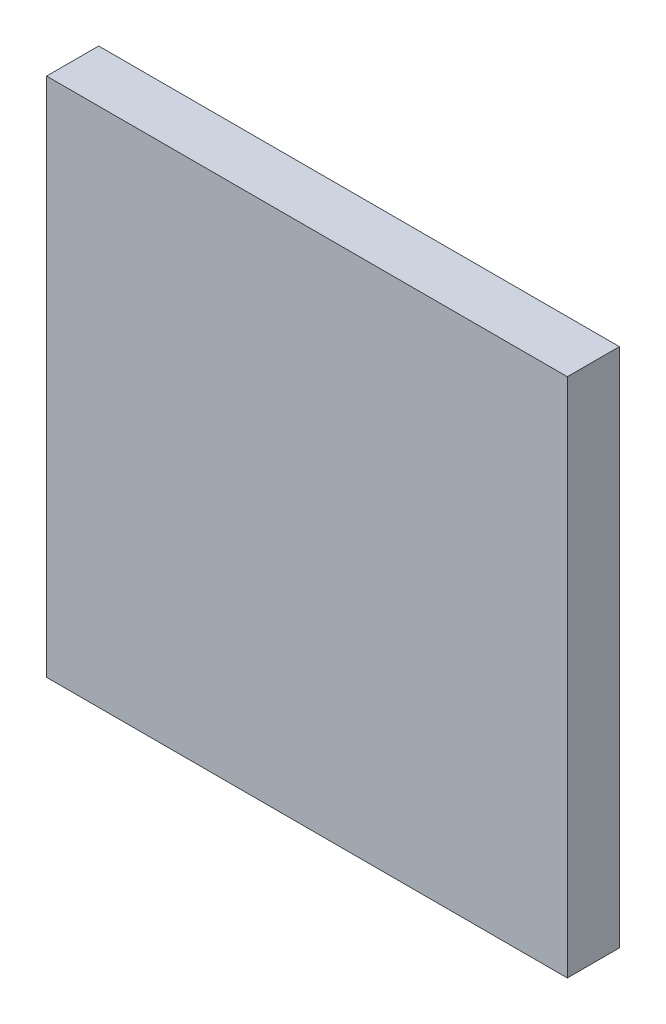
ISO-10303-21;
HEADER;
FILE_DESCRIPTION(('STEP AP214'),'2;1');
FILE_NAME('part.step','',(''),(''),'','','');
FILE_SCHEMA(('AUTOMOTIVE_DESIGN { 1 0 10303 214 1 1 1 1 }'));
ENDSEC;
DATA;
#1=APPLICATION_CONTEXT('core data for automotive mechanical design processes');
#2=APPLICATION_PROTOCOL_DEFINITION('international standard','automotive_design',2000,#1);
#3=PRODUCT_CONTEXT('',#1,'mechanical');
#4=PRODUCT('Part','Part','',(#3));
#5=PRODUCT_RELATED_PRODUCT_CATEGORY('part','',(#4));
#6=PRODUCT_DEFINITION_FORMATION('','',#4);
#7=PRODUCT_DEFINITION_CONTEXT('part definition',#1,'design');
#8=PRODUCT_DEFINITION('design','',#6,#7);
#9=PRODUCT_DEFINITION_SHAPE('','',#8);
#10=(LENGTH_UNIT() NAMED_UNIT(*) SI_UNIT(.MILLI.,.METRE.));
#11=(NAMED_UNIT(*) PLANE_ANGLE_UNIT() SI_UNIT($,.RADIAN.));
#12=(NAMED_UNIT(*) SI_UNIT($,.STERADIAN.) SOLID_ANGLE_UNIT());
#13=UNCERTAINTY_MEASURE_WITH_UNIT(LENGTH_MEASURE(1.E-05),#10,'distance_accuracy_value','');
#14=(GEOMETRIC_REPRESENTATION_CONTEXT(3) GLOBAL_UNCERTAINTY_ASSIGNED_CONTEXT((#13)) GLOBAL_UNIT_ASSIGNED_CONTEXT((#10,
#11,#12)) REPRESENTATION_CONTEXT('',''));
#15=CARTESIAN_POINT('',(0.,0.,0.));
#16=DIRECTION('',(0.,0.,1.));
#17=DIRECTION('',(1.,0.,0.));
#18=AXIS2_PLACEMENT_3D('',#15,#16,#17);
#19=CARTESIAN_POINT('',(-50.2232340022324,-8.88077858880779,10.));
#20=DIRECTION('',(0.,1.,0.));
#21=DIRECTION('',(-1.,0.,0.));
#22=AXIS2_PLACEMENT_3D('',#19,#20,#21);
#23=PLANE('',#22);
#24=DIRECTION('',(1.,0.,0.));
#25=VECTOR('',#24,1.);
#26=CARTESIAN_POINT('',(-50.2232340022324,-8.88077858880779,0.));
#27=LINE('',#26,#25);
#28=CARTESIAN_POINT('',(-50.2232340022324,-8.88077858880779,0.));
#29=VERTEX_POINT('',#28);
#30=CARTESIAN_POINT('',(49.7767659977676,-8.88077858880814,0.));
#31=VERTEX_POINT('',#30);
#32=EDGE_CURVE('E108',#29,#31,#27,.T.);
#33=ORIENTED_EDGE('',*,*,#32,.T.);
#34=DIRECTION('',(0.,0.,-1.));
#35=VECTOR('',#34,1.);
#36=CARTESIAN_POINT('',(49.7767659977676,-8.88077858880814,10.));
#37=LINE('',#36,#35);
#38=CARTESIAN_POINT('',(49.7767659977676,-8.88077858880814,10.));
#39=VERTEX_POINT('',#38);
#40=EDGE_CURVE('E11',#39,#31,#37,.T.);
#41=ORIENTED_EDGE('',*,*,#40,.F.);
#42=DIRECTION('',(1.,0.,0.));
#43=VECTOR('',#42,1.);
#44=CARTESIAN_POINT('',(-50.2232340022324,-8.88077858880779,10.));
#45=LINE('',#44,#43);
#46=CARTESIAN_POINT('',(-50.2232340022324,-8.88077858880779,10.));
#47=VERTEX_POINT('',#46);
#48=EDGE_CURVE('E89',#47,#39,#45,.T.);
#49=ORIENTED_EDGE('',*,*,#48,.F.);
#50=DIRECTION('',(0.,0.,-1.));
#51=VECTOR('',#50,1.);
#52=CARTESIAN_POINT('',(-50.2232340022324,-8.88077858880779,10.));
#53=LINE('',#52,#51);
#54=EDGE_CURVE('E56',#47,#29,#53,.T.);
#55=ORIENTED_EDGE('',*,*,#54,.T.);
#56=EDGE_LOOP('',(#33,#41,#49,#55));
#57=FACE_BOUND('',#56,.T.);
#58=ADVANCED_FACE('F39',(#57),#23,.F.);
#59=CARTESIAN_POINT('',(49.7767659977676,-8.88077858880814,10.));
#60=DIRECTION('',(-1.,0.,0.));
#61=DIRECTION('',(0.,-1.,0.));
#62=AXIS2_PLACEMENT_3D('',#59,#60,#61);
#63=PLANE('',#62);
#64=DIRECTION('',(0.,1.,0.));
#65=VECTOR('',#64,1.);
#66=CARTESIAN_POINT('',(49.7767659977676,-8.88077858880814,0.));
#67=LINE('',#66,#65);
#68=CARTESIAN_POINT('',(49.7767659977676,91.1192214111919,0.));
#69=VERTEX_POINT('',#68);
#70=EDGE_CURVE('E95',#31,#69,#67,.T.);
#71=ORIENTED_EDGE('',*,*,#70,.T.);
#72=DIRECTION('',(0.,0.,-1.));
#73=VECTOR('',#72,1.);
#74=CARTESIAN_POINT('',(49.7767659977676,91.1192214111919,10.));
#75=LINE('',#74,#73);
#76=CARTESIAN_POINT('',(49.7767659977676,91.1192214111919,10.));
#77=VERTEX_POINT('',#76);
#78=EDGE_CURVE('E48',#77,#69,#75,.T.);
#79=ORIENTED_EDGE('',*,*,#78,.F.);
#80=DIRECTION('',(0.,1.,0.));
#81=VECTOR('',#80,1.);
#82=CARTESIAN_POINT('',(49.7767659977676,-8.88077858880814,10.));
#83=LINE('',#82,#81);
#84=EDGE_CURVE('E81',#39,#77,#83,.T.);
#85=ORIENTED_EDGE('',*,*,#84,.F.);
#86=ORIENTED_EDGE('',*,*,#40,.T.);
#87=EDGE_LOOP('',(#71,#79,#85,#86));
#88=FACE_BOUND('',#87,.T.);
#89=ADVANCED_FACE('F94',(#88),#63,.F.);
#90=CARTESIAN_POINT('',(-50.2232340022324,91.1192214111922,10.));
#91=DIRECTION('',(0.,1.,0.));
#92=DIRECTION('',(-1.,0.,0.));
#93=AXIS2_PLACEMENT_3D('',#90,#91,#92);
#94=PLANE('',#93);
#95=DIRECTION('',(1.,0.,0.));
#96=VECTOR('',#95,1.);
#97=CARTESIAN_POINT('',(-50.2232340022324,91.1192214111922,0.));
#98=LINE('',#97,#96);
#99=CARTESIAN_POINT('',(-50.2232340022324,91.1192214111922,0.));
#100=VERTEX_POINT('',#99);
#101=EDGE_CURVE('E113',#100,#69,#98,.T.);
#102=ORIENTED_EDGE('',*,*,#101,.F.);
#103=DIRECTION('',(0.,0.,-1.));
#104=VECTOR('',#103,1.);
#105=CARTESIAN_POINT('',(-50.2232340022324,91.1192214111922,10.));
#106=LINE('',#105,#104);
#107=CARTESIAN_POINT('',(-50.2232340022324,91.1192214111922,10.));
#108=VERTEX_POINT('',#107);
#109=EDGE_CURVE('E70',#108,#100,#106,.T.);
#110=ORIENTED_EDGE('',*,*,#109,.F.);
#111=DIRECTION('',(1.,0.,0.));
#112=VECTOR('',#111,1.);
#113=CARTESIAN_POINT('',(-50.2232340022324,91.1192214111922,10.));
#114=LINE('',#113,#112);
#115=EDGE_CURVE('E88',#108,#77,#114,.T.);
#116=ORIENTED_EDGE('',*,*,#115,.T.);
#117=ORIENTED_EDGE('',*,*,#78,.T.);
#118=EDGE_LOOP('',(#102,#110,#116,#117));
#119=FACE_BOUND('',#118,.T.);
#120=ADVANCED_FACE('F99',(#119),#94,.T.);
#121=CARTESIAN_POINT('',(-50.2232340022324,-8.88077858880779,10.));
#122=DIRECTION('',(-1.,0.,0.));
#123=DIRECTION('',(0.,0.,1.));
#124=AXIS2_PLACEMENT_3D('',#121,#122,#123);
#125=PLANE('',#124);
#126=DIRECTION('',(0.,1.,0.));
#127=VECTOR('',#126,1.);
#128=CARTESIAN_POINT('',(-50.2232340022324,-8.88077858880779,0.));
#129=LINE('',#128,#127);
#130=EDGE_CURVE('E116',#29,#100,#129,.T.);
#131=ORIENTED_EDGE('',*,*,#130,.F.);
#132=ORIENTED_EDGE('',*,*,#54,.F.);
#133=DIRECTION('',(0.,1.,0.));
#134=VECTOR('',#133,1.);
#135=CARTESIAN_POINT('',(-50.2232340022324,-8.88077858880779,10.));
#136=LINE('',#135,#134);
#137=EDGE_CURVE('E101',#47,#108,#136,.T.);
#138=ORIENTED_EDGE('',*,*,#137,.T.);
#139=ORIENTED_EDGE('',*,*,#109,.T.);
#140=EDGE_LOOP('',(#131,#132,#138,#139));
#141=FACE_BOUND('',#140,.T.);
#142=ADVANCED_FACE('F134',(#141),#125,.T.);
#143=CARTESIAN_POINT('',(0.,0.,10.));
#144=DIRECTION('',(0.,0.,1.));
#145=DIRECTION('',(1.,0.,0.));
#146=AXIS2_PLACEMENT_3D('',#143,#144,#145);
#147=PLANE('',#146);
#148=ORIENTED_EDGE('',*,*,#48,.T.);
#149=ORIENTED_EDGE('',*,*,#84,.T.);
#150=ORIENTED_EDGE('',*,*,#115,.F.);
#151=ORIENTED_EDGE('',*,*,#137,.F.);
#152=EDGE_LOOP('',(#148,#149,#150,#151));
#153=FACE_BOUND('',#152,.T.);
#154=ADVANCED_FACE('F85',(#153),#147,.T.);
#155=CARTESIAN_POINT('',(0.,0.,0.));
#156=DIRECTION('',(0.,0.,1.));
#157=DIRECTION('',(1.,0.,0.));
#158=AXIS2_PLACEMENT_3D('',#155,#156,#157);
#159=PLANE('',#158);
#160=ORIENTED_EDGE('',*,*,#32,.F.);
#161=ORIENTED_EDGE('',*,*,#130,.T.);
#162=ORIENTED_EDGE('',*,*,#101,.T.);
#163=ORIENTED_EDGE('',*,*,#70,.F.);
#164=EDGE_LOOP('',(#160,#161,#162,#163));
#165=FACE_BOUND('',#164,.T.);
#166=ADVANCED_FACE('F133',(#165),#159,.F.);
#167=CLOSED_SHELL('',(#58,#89,#120,#142,#154,#166));
#168=MANIFOLD_SOLID_BREP('B2',#167);
#169=ADVANCED_BREP_SHAPE_REPRESENTATION('',(#18,#168),#14);
#170=SHAPE_DEFINITION_REPRESENTATION(#9,#169);
ENDSEC;
END-ISO-10303-21;
